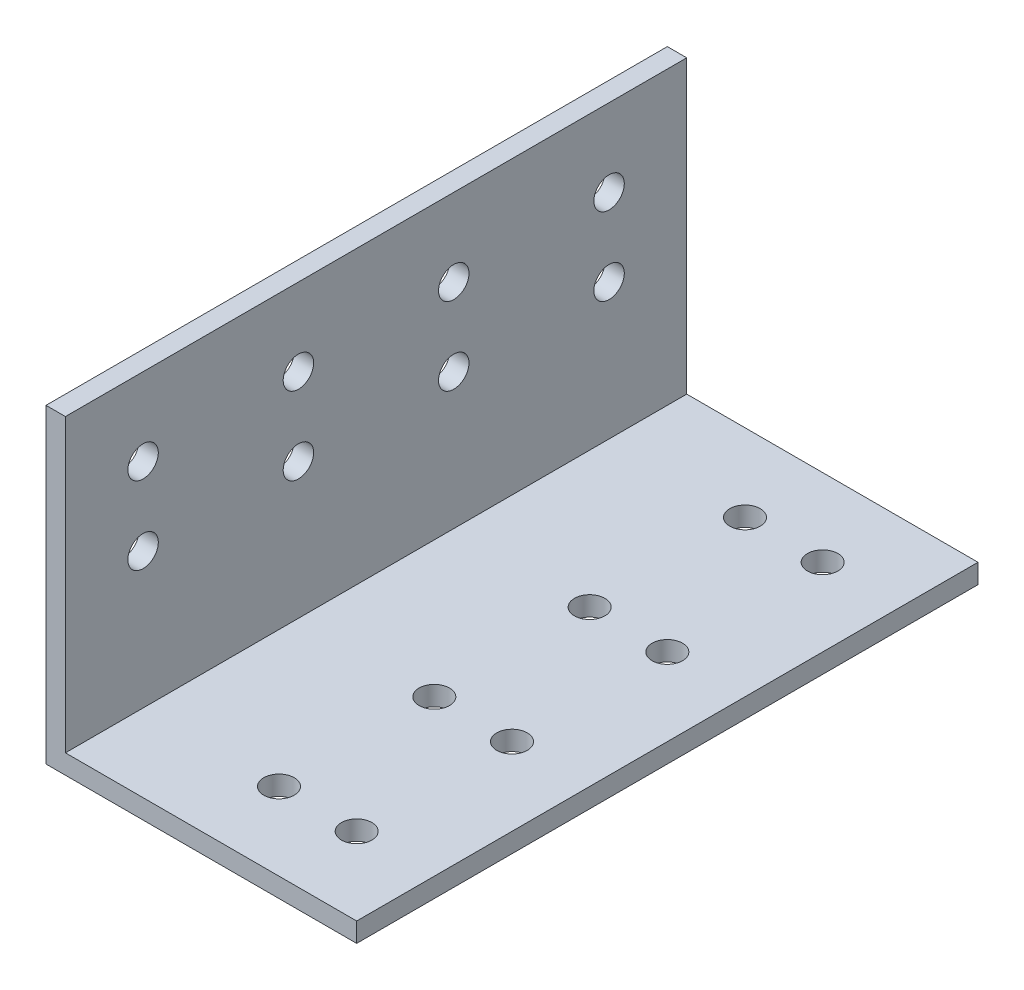
ISO-10303-21;
HEADER;
FILE_DESCRIPTION(('STEP AP214'),'2;1');
FILE_NAME('part.step','',(''),(''),'','','');
FILE_SCHEMA(('AUTOMOTIVE_DESIGN { 1 0 10303 214 1 1 1 1 }'));
ENDSEC;
DATA;
#1=APPLICATION_CONTEXT('core data for automotive mechanical design processes');
#2=APPLICATION_PROTOCOL_DEFINITION('international standard','automotive_design',2000,#1);
#3=PRODUCT_CONTEXT('',#1,'mechanical');
#4=PRODUCT('Part','Part','',(#3));
#5=PRODUCT_RELATED_PRODUCT_CATEGORY('part','',(#4));
#6=PRODUCT_DEFINITION_FORMATION('','',#4);
#7=PRODUCT_DEFINITION_CONTEXT('part definition',#1,'design');
#8=PRODUCT_DEFINITION('design','',#6,#7);
#9=PRODUCT_DEFINITION_SHAPE('','',#8);
#10=(LENGTH_UNIT() NAMED_UNIT(*) SI_UNIT(.MILLI.,.METRE.));
#11=(NAMED_UNIT(*) PLANE_ANGLE_UNIT() SI_UNIT($,.RADIAN.));
#12=(NAMED_UNIT(*) SI_UNIT($,.STERADIAN.) SOLID_ANGLE_UNIT());
#13=UNCERTAINTY_MEASURE_WITH_UNIT(LENGTH_MEASURE(1.E-05),#10,'distance_accuracy_value','');
#14=(GEOMETRIC_REPRESENTATION_CONTEXT(3) GLOBAL_UNCERTAINTY_ASSIGNED_CONTEXT((#13)) GLOBAL_UNIT_ASSIGNED_CONTEXT((#10,
#11,#12)) REPRESENTATION_CONTEXT('',''));
#15=CARTESIAN_POINT('',(0.,0.,0.));
#16=DIRECTION('',(0.,0.,1.));
#17=DIRECTION('',(1.,0.,0.));
#18=AXIS2_PLACEMENT_3D('',#15,#16,#17);
#19=CARTESIAN_POINT('',(0.,50.8,101.6));
#20=DIRECTION('',(0.,1.,0.));
#21=DIRECTION('',(0.,0.,1.));
#22=AXIS2_PLACEMENT_3D('',#19,#20,#21);
#23=PLANE('',#22);
#24=DIRECTION('',(1.,0.,0.));
#25=VECTOR('',#24,1.);
#26=CARTESIAN_POINT('',(0.,50.8,0.));
#27=LINE('',#26,#25);
#28=CARTESIAN_POINT('',(0.,50.8,0.));
#29=VERTEX_POINT('',#28);
#30=CARTESIAN_POINT('',(3.175,50.8,0.));
#31=VERTEX_POINT('',#30);
#32=EDGE_CURVE('E129',#29,#31,#27,.T.);
#33=ORIENTED_EDGE('',*,*,#32,.F.);
#34=DIRECTION('',(0.,0.,-1.));
#35=VECTOR('',#34,1.);
#36=CARTESIAN_POINT('',(0.,50.8,101.6));
#37=LINE('',#36,#35);
#38=CARTESIAN_POINT('',(0.,50.8,101.6));
#39=VERTEX_POINT('',#38);
#40=EDGE_CURVE('E11',#39,#29,#37,.T.);
#41=ORIENTED_EDGE('',*,*,#40,.F.);
#42=DIRECTION('',(1.,0.,0.));
#43=VECTOR('',#42,1.);
#44=CARTESIAN_POINT('',(0.,50.8,101.6));
#45=LINE('',#44,#43);
#46=CARTESIAN_POINT('',(3.175,50.8,101.6));
#47=VERTEX_POINT('',#46);
#48=EDGE_CURVE('E150',#39,#47,#45,.T.);
#49=ORIENTED_EDGE('',*,*,#48,.T.);
#50=DIRECTION('',(0.,0.,-1.));
#51=VECTOR('',#50,1.);
#52=CARTESIAN_POINT('',(3.175,50.8,101.6));
#53=LINE('',#52,#51);
#54=EDGE_CURVE('E40',#47,#31,#53,.T.);
#55=ORIENTED_EDGE('',*,*,#54,.T.);
#56=EDGE_LOOP('',(#33,#41,#49,#55));
#57=FACE_BOUND('',#56,.T.);
#58=ADVANCED_FACE('F37',(#57),#23,.T.);
#59=CARTESIAN_POINT('',(0.,0.,101.6));
#60=DIRECTION('',(-1.,0.,0.));
#61=DIRECTION('',(0.,0.,1.));
#62=AXIS2_PLACEMENT_3D('',#59,#60,#61);
#63=PLANE('',#62);
#64=CARTESIAN_POINT('',(0.,38.0999999999998,38.1));
#65=DIRECTION('',(1.,0.,0.));
#66=DIRECTION('',(0.,1.,0.));
#67=AXIS2_PLACEMENT_3D('',#64,#65,#66);
#68=CIRCLE('',#67,2.4892);
#69=CARTESIAN_POINT('',(0.,40.5891999999998,38.1));
#70=VERTEX_POINT('',#69);
#71=EDGE_CURVE('E427',#70,#70,#68,.T.);
#72=ORIENTED_EDGE('',*,*,#71,.T.);
#73=EDGE_LOOP('',(#72));
#74=FACE_BOUND('',#73,.T.);
#75=CARTESIAN_POINT('',(0.,25.3999999999995,88.9));
#76=DIRECTION('',(1.,0.,0.));
#77=DIRECTION('',(0.,1.,0.));
#78=AXIS2_PLACEMENT_3D('',#75,#76,#77);
#79=CIRCLE('',#78,2.48920000000002);
#80=CARTESIAN_POINT('',(0.,27.8891999999995,88.9));
#81=VERTEX_POINT('',#80);
#82=EDGE_CURVE('E421',#81,#81,#79,.T.);
#83=ORIENTED_EDGE('',*,*,#82,.T.);
#84=EDGE_LOOP('',(#83));
#85=FACE_BOUND('',#84,.T.);
#86=CARTESIAN_POINT('',(0.,25.3999999999996,63.5));
#87=DIRECTION('',(1.,0.,0.));
#88=DIRECTION('',(0.,1.,0.));
#89=AXIS2_PLACEMENT_3D('',#86,#87,#88);
#90=CIRCLE('',#89,2.4892);
#91=CARTESIAN_POINT('',(0.,27.8891999999996,63.5));
#92=VERTEX_POINT('',#91);
#93=EDGE_CURVE('E434',#92,#92,#90,.T.);
#94=ORIENTED_EDGE('',*,*,#93,.T.);
#95=EDGE_LOOP('',(#94));
#96=FACE_BOUND('',#95,.T.);
#97=CARTESIAN_POINT('',(0.,25.3999999999998,38.1));
#98=DIRECTION('',(1.,0.,0.));
#99=DIRECTION('',(0.,1.,0.));
#100=AXIS2_PLACEMENT_3D('',#97,#98,#99);
#101=CIRCLE('',#100,2.4892);
#102=CARTESIAN_POINT('',(0.,27.8891999999998,38.1));
#103=VERTEX_POINT('',#102);
#104=EDGE_CURVE('E223',#103,#103,#101,.T.);
#105=ORIENTED_EDGE('',*,*,#104,.T.);
#106=EDGE_LOOP('',(#105));
#107=FACE_BOUND('',#106,.T.);
#108=CARTESIAN_POINT('',(0.,38.0999999999996,63.5));
#109=DIRECTION('',(1.,0.,0.));
#110=DIRECTION('',(0.,1.,0.));
#111=AXIS2_PLACEMENT_3D('',#108,#109,#110);
#112=CIRCLE('',#111,2.4892);
#113=CARTESIAN_POINT('',(0.,40.5891999999996,63.5));
#114=VERTEX_POINT('',#113);
#115=EDGE_CURVE('E402',#114,#114,#112,.T.);
#116=ORIENTED_EDGE('',*,*,#115,.T.);
#117=EDGE_LOOP('',(#116));
#118=FACE_BOUND('',#117,.T.);
#119=CARTESIAN_POINT('',(0.,38.0999999999995,88.9));
#120=DIRECTION('',(1.,0.,0.));
#121=DIRECTION('',(0.,1.,0.));
#122=AXIS2_PLACEMENT_3D('',#119,#120,#121);
#123=CIRCLE('',#122,2.48920000000002);
#124=CARTESIAN_POINT('',(0.,40.5891999999995,88.9));
#125=VERTEX_POINT('',#124);
#126=EDGE_CURVE('E404',#125,#125,#123,.T.);
#127=ORIENTED_EDGE('',*,*,#126,.T.);
#128=EDGE_LOOP('',(#127));
#129=FACE_BOUND('',#128,.T.);
#130=CARTESIAN_POINT('',(0.,38.1,12.7));
#131=DIRECTION('',(1.,0.,0.));
#132=DIRECTION('',(0.,1.,0.));
#133=AXIS2_PLACEMENT_3D('',#130,#131,#132);
#134=CIRCLE('',#133,2.4892);
#135=CARTESIAN_POINT('',(0.,40.5892,12.7));
#136=VERTEX_POINT('',#135);
#137=EDGE_CURVE('E415',#136,#136,#134,.T.);
#138=ORIENTED_EDGE('',*,*,#137,.T.);
#139=EDGE_LOOP('',(#138));
#140=FACE_BOUND('',#139,.T.);
#141=CARTESIAN_POINT('',(0.,25.4,12.7));
#142=DIRECTION('',(1.,0.,0.));
#143=DIRECTION('',(0.,1.,0.));
#144=AXIS2_PLACEMENT_3D('',#141,#142,#143);
#145=CIRCLE('',#144,2.4892);
#146=CARTESIAN_POINT('',(0.,27.8892,12.7));
#147=VERTEX_POINT('',#146);
#148=EDGE_CURVE('E222',#147,#147,#145,.T.);
#149=ORIENTED_EDGE('',*,*,#148,.T.);
#150=EDGE_LOOP('',(#149));
#151=FACE_BOUND('',#150,.T.);
#152=DIRECTION('',(0.,1.,0.));
#153=VECTOR('',#152,1.);
#154=CARTESIAN_POINT('',(0.,0.,0.));
#155=LINE('',#154,#153);
#156=CARTESIAN_POINT('',(0.,0.,0.));
#157=VERTEX_POINT('',#156);
#158=EDGE_CURVE('E147',#157,#29,#155,.T.);
#159=ORIENTED_EDGE('',*,*,#158,.F.);
#160=DIRECTION('',(0.,0.,-1.));
#161=VECTOR('',#160,1.);
#162=CARTESIAN_POINT('',(0.,0.,101.6));
#163=LINE('',#162,#161);
#164=CARTESIAN_POINT('',(0.,0.,101.6));
#165=VERTEX_POINT('',#164);
#166=EDGE_CURVE('E47',#165,#157,#163,.T.);
#167=ORIENTED_EDGE('',*,*,#166,.F.);
#168=DIRECTION('',(0.,1.,0.));
#169=VECTOR('',#168,1.);
#170=CARTESIAN_POINT('',(0.,0.,101.6));
#171=LINE('',#170,#169);
#172=EDGE_CURVE('E114',#165,#39,#171,.T.);
#173=ORIENTED_EDGE('',*,*,#172,.T.);
#174=ORIENTED_EDGE('',*,*,#40,.T.);
#175=EDGE_LOOP('',(#159,#167,#173,#174));
#176=FACE_BOUND('',#175,.T.);
#177=ADVANCED_FACE('F164',(#74,#85,#96,#107,#118,#129,#140,#151,#176),#63,.T.);
#178=CARTESIAN_POINT('',(50.8,0.,101.6));
#179=DIRECTION('',(0.,-1.,0.));
#180=DIRECTION('',(1.,0.,0.));
#181=AXIS2_PLACEMENT_3D('',#178,#179,#180);
#182=PLANE('',#181);
#183=CARTESIAN_POINT('',(25.4,0.,88.9000000000002));
#184=DIRECTION('',(0.,1.,0.));
#185=DIRECTION('',(-1.,0.,0.));
#186=AXIS2_PLACEMENT_3D('',#183,#184,#185);
#187=CIRCLE('',#186,2.4892);
#188=CARTESIAN_POINT('',(22.9108,0.,88.9000000000002));
#189=VERTEX_POINT('',#188);
#190=EDGE_CURVE('E284',#189,#189,#187,.T.);
#191=ORIENTED_EDGE('',*,*,#190,.T.);
#192=EDGE_LOOP('',(#191));
#193=FACE_BOUND('',#192,.T.);
#194=CARTESIAN_POINT('',(25.4,0.,63.5000000000002));
#195=DIRECTION('',(0.,1.,0.));
#196=DIRECTION('',(-1.,0.,0.));
#197=AXIS2_PLACEMENT_3D('',#194,#195,#196);
#198=CIRCLE('',#197,2.4892);
#199=CARTESIAN_POINT('',(22.9108,0.,63.5000000000002));
#200=VERTEX_POINT('',#199);
#201=EDGE_CURVE('E276',#200,#200,#198,.T.);
#202=ORIENTED_EDGE('',*,*,#201,.T.);
#203=EDGE_LOOP('',(#202));
#204=FACE_BOUND('',#203,.T.);
#205=CARTESIAN_POINT('',(25.4,0.,38.1000000000002));
#206=DIRECTION('',(0.,1.,0.));
#207=DIRECTION('',(-1.,0.,0.));
#208=AXIS2_PLACEMENT_3D('',#205,#206,#207);
#209=CIRCLE('',#208,2.4892);
#210=CARTESIAN_POINT('',(22.9108,0.,38.1000000000002));
#211=VERTEX_POINT('',#210);
#212=EDGE_CURVE('E268',#211,#211,#209,.T.);
#213=ORIENTED_EDGE('',*,*,#212,.T.);
#214=EDGE_LOOP('',(#213));
#215=FACE_BOUND('',#214,.T.);
#216=CARTESIAN_POINT('',(38.1,0.,88.9));
#217=DIRECTION('',(0.,1.,0.));
#218=DIRECTION('',(-1.,0.,0.));
#219=AXIS2_PLACEMENT_3D('',#216,#217,#218);
#220=CIRCLE('',#219,2.4892);
#221=CARTESIAN_POINT('',(35.6108,0.,88.9));
#222=VERTEX_POINT('',#221);
#223=EDGE_CURVE('E260',#222,#222,#220,.T.);
#224=ORIENTED_EDGE('',*,*,#223,.T.);
#225=EDGE_LOOP('',(#224));
#226=FACE_BOUND('',#225,.T.);
#227=CARTESIAN_POINT('',(38.1,0.,63.5));
#228=DIRECTION('',(0.,1.,0.));
#229=DIRECTION('',(-1.,0.,0.));
#230=AXIS2_PLACEMENT_3D('',#227,#228,#229);
#231=CIRCLE('',#230,2.4892);
#232=CARTESIAN_POINT('',(35.6108,0.,63.5));
#233=VERTEX_POINT('',#232);
#234=EDGE_CURVE('E252',#233,#233,#231,.T.);
#235=ORIENTED_EDGE('',*,*,#234,.T.);
#236=EDGE_LOOP('',(#235));
#237=FACE_BOUND('',#236,.T.);
#238=CARTESIAN_POINT('',(38.1,0.,38.1));
#239=DIRECTION('',(0.,1.,0.));
#240=DIRECTION('',(-1.,0.,0.));
#241=AXIS2_PLACEMENT_3D('',#238,#239,#240);
#242=CIRCLE('',#241,2.4892);
#243=CARTESIAN_POINT('',(35.6108,0.,38.1));
#244=VERTEX_POINT('',#243);
#245=EDGE_CURVE('E244',#244,#244,#242,.T.);
#246=ORIENTED_EDGE('',*,*,#245,.T.);
#247=EDGE_LOOP('',(#246));
#248=FACE_BOUND('',#247,.T.);
#249=CARTESIAN_POINT('',(38.1,0.,12.7));
#250=DIRECTION('',(0.,1.,0.));
#251=DIRECTION('',(-1.,0.,0.));
#252=AXIS2_PLACEMENT_3D('',#249,#250,#251);
#253=CIRCLE('',#252,2.4892);
#254=CARTESIAN_POINT('',(35.6108,0.,12.7));
#255=VERTEX_POINT('',#254);
#256=EDGE_CURVE('E235',#255,#255,#253,.T.);
#257=ORIENTED_EDGE('',*,*,#256,.T.);
#258=EDGE_LOOP('',(#257));
#259=FACE_BOUND('',#258,.T.);
#260=CARTESIAN_POINT('',(25.4,0.,12.7000000000002));
#261=DIRECTION('',(0.,1.,0.));
#262=DIRECTION('',(-1.,0.,0.));
#263=AXIS2_PLACEMENT_3D('',#260,#261,#262);
#264=CIRCLE('',#263,2.4892);
#265=CARTESIAN_POINT('',(22.9108,0.,12.7000000000002));
#266=VERTEX_POINT('',#265);
#267=EDGE_CURVE('E134',#266,#266,#264,.T.);
#268=ORIENTED_EDGE('',*,*,#267,.T.);
#269=EDGE_LOOP('',(#268));
#270=FACE_BOUND('',#269,.T.);
#271=DIRECTION('',(-1.,0.,0.));
#272=VECTOR('',#271,1.);
#273=CARTESIAN_POINT('',(50.8,0.,0.));
#274=LINE('',#273,#272);
#275=CARTESIAN_POINT('',(50.8,0.,0.));
#276=VERTEX_POINT('',#275);
#277=EDGE_CURVE('E100',#276,#157,#274,.T.);
#278=ORIENTED_EDGE('',*,*,#277,.F.);
#279=DIRECTION('',(0.,0.,-1.));
#280=VECTOR('',#279,1.);
#281=CARTESIAN_POINT('',(50.8,0.,101.6));
#282=LINE('',#281,#280);
#283=CARTESIAN_POINT('',(50.8,0.,101.6));
#284=VERTEX_POINT('',#283);
#285=EDGE_CURVE('E95',#284,#276,#282,.T.);
#286=ORIENTED_EDGE('',*,*,#285,.F.);
#287=DIRECTION('',(-1.,0.,0.));
#288=VECTOR('',#287,1.);
#289=CARTESIAN_POINT('',(50.8,0.,101.6));
#290=LINE('',#289,#288);
#291=EDGE_CURVE('E98',#284,#165,#290,.T.);
#292=ORIENTED_EDGE('',*,*,#291,.T.);
#293=ORIENTED_EDGE('',*,*,#166,.T.);
#294=EDGE_LOOP('',(#278,#286,#292,#293));
#295=FACE_BOUND('',#294,.T.);
#296=ADVANCED_FACE('F97',(#193,#204,#215,#226,#237,#248,#259,#270,#295),#182,.T.);
#297=CARTESIAN_POINT('',(50.8,3.175,101.6));
#298=DIRECTION('',(1.,0.,0.));
#299=DIRECTION('',(0.,0.,-1.));
#300=AXIS2_PLACEMENT_3D('',#297,#298,#299);
#301=PLANE('',#300);
#302=DIRECTION('',(0.,-1.,0.));
#303=VECTOR('',#302,1.);
#304=CARTESIAN_POINT('',(50.8,3.175,0.));
#305=LINE('',#304,#303);
#306=CARTESIAN_POINT('',(50.8,3.175,0.));
#307=VERTEX_POINT('',#306);
#308=EDGE_CURVE('E142',#307,#276,#305,.T.);
#309=ORIENTED_EDGE('',*,*,#308,.F.);
#310=DIRECTION('',(0.,0.,-1.));
#311=VECTOR('',#310,1.);
#312=CARTESIAN_POINT('',(50.8,3.175,101.6));
#313=LINE('',#312,#311);
#314=CARTESIAN_POINT('',(50.8,3.175,101.6));
#315=VERTEX_POINT('',#314);
#316=EDGE_CURVE('E106',#315,#307,#313,.T.);
#317=ORIENTED_EDGE('',*,*,#316,.F.);
#318=DIRECTION('',(0.,-1.,0.));
#319=VECTOR('',#318,1.);
#320=CARTESIAN_POINT('',(50.8,3.175,101.6));
#321=LINE('',#320,#319);
#322=EDGE_CURVE('E112',#315,#284,#321,.T.);
#323=ORIENTED_EDGE('',*,*,#322,.T.);
#324=ORIENTED_EDGE('',*,*,#285,.T.);
#325=EDGE_LOOP('',(#309,#317,#323,#324));
#326=FACE_BOUND('',#325,.T.);
#327=ADVANCED_FACE('F117',(#326),#301,.T.);
#328=CARTESIAN_POINT('',(3.175,3.175,101.6));
#329=DIRECTION('',(0.,1.,0.));
#330=DIRECTION('',(-1.,0.,0.));
#331=AXIS2_PLACEMENT_3D('',#328,#329,#330);
#332=PLANE('',#331);
#333=CARTESIAN_POINT('',(25.4,3.175,88.9000000000002));
#334=DIRECTION('',(0.,1.,0.));
#335=DIRECTION('',(-1.,0.,0.));
#336=AXIS2_PLACEMENT_3D('',#333,#334,#335);
#337=CIRCLE('',#336,2.4892);
#338=CARTESIAN_POINT('',(22.9108,3.175,88.9000000000002));
#339=VERTEX_POINT('',#338);
#340=EDGE_CURVE('E229',#339,#339,#337,.T.);
#341=ORIENTED_EDGE('',*,*,#340,.F.);
#342=EDGE_LOOP('',(#341));
#343=FACE_BOUND('',#342,.T.);
#344=CARTESIAN_POINT('',(25.4,3.175,63.5000000000002));
#345=DIRECTION('',(0.,1.,0.));
#346=DIRECTION('',(-1.,0.,0.));
#347=AXIS2_PLACEMENT_3D('',#344,#345,#346);
#348=CIRCLE('',#347,2.4892);
#349=CARTESIAN_POINT('',(22.9108,3.175,63.5000000000002));
#350=VERTEX_POINT('',#349);
#351=EDGE_CURVE('E280',#350,#350,#348,.T.);
#352=ORIENTED_EDGE('',*,*,#351,.F.);
#353=EDGE_LOOP('',(#352));
#354=FACE_BOUND('',#353,.T.);
#355=CARTESIAN_POINT('',(25.4,3.175,38.1000000000002));
#356=DIRECTION('',(0.,1.,0.));
#357=DIRECTION('',(-1.,0.,0.));
#358=AXIS2_PLACEMENT_3D('',#355,#356,#357);
#359=CIRCLE('',#358,2.4892);
#360=CARTESIAN_POINT('',(22.9108,3.175,38.1000000000002));
#361=VERTEX_POINT('',#360);
#362=EDGE_CURVE('E272',#361,#361,#359,.T.);
#363=ORIENTED_EDGE('',*,*,#362,.F.);
#364=EDGE_LOOP('',(#363));
#365=FACE_BOUND('',#364,.T.);
#366=CARTESIAN_POINT('',(38.1,3.175,88.9));
#367=DIRECTION('',(0.,1.,0.));
#368=DIRECTION('',(-1.,0.,0.));
#369=AXIS2_PLACEMENT_3D('',#366,#367,#368);
#370=CIRCLE('',#369,2.4892);
#371=CARTESIAN_POINT('',(35.6108,3.175,88.9));
#372=VERTEX_POINT('',#371);
#373=EDGE_CURVE('E264',#372,#372,#370,.T.);
#374=ORIENTED_EDGE('',*,*,#373,.F.);
#375=EDGE_LOOP('',(#374));
#376=FACE_BOUND('',#375,.T.);
#377=CARTESIAN_POINT('',(38.1,3.175,63.5));
#378=DIRECTION('',(0.,1.,0.));
#379=DIRECTION('',(-1.,0.,0.));
#380=AXIS2_PLACEMENT_3D('',#377,#378,#379);
#381=CIRCLE('',#380,2.4892);
#382=CARTESIAN_POINT('',(35.6108,3.175,63.5));
#383=VERTEX_POINT('',#382);
#384=EDGE_CURVE('E256',#383,#383,#381,.T.);
#385=ORIENTED_EDGE('',*,*,#384,.F.);
#386=EDGE_LOOP('',(#385));
#387=FACE_BOUND('',#386,.T.);
#388=CARTESIAN_POINT('',(38.1,3.175,38.1));
#389=DIRECTION('',(0.,1.,0.));
#390=DIRECTION('',(-1.,0.,0.));
#391=AXIS2_PLACEMENT_3D('',#388,#389,#390);
#392=CIRCLE('',#391,2.4892);
#393=CARTESIAN_POINT('',(35.6108,3.175,38.1));
#394=VERTEX_POINT('',#393);
#395=EDGE_CURVE('E248',#394,#394,#392,.T.);
#396=ORIENTED_EDGE('',*,*,#395,.F.);
#397=EDGE_LOOP('',(#396));
#398=FACE_BOUND('',#397,.T.);
#399=CARTESIAN_POINT('',(38.1,3.175,12.7));
#400=DIRECTION('',(0.,1.,0.));
#401=DIRECTION('',(-1.,0.,0.));
#402=AXIS2_PLACEMENT_3D('',#399,#400,#401);
#403=CIRCLE('',#402,2.4892);
#404=CARTESIAN_POINT('',(35.6108,3.175,12.7));
#405=VERTEX_POINT('',#404);
#406=EDGE_CURVE('E240',#405,#405,#403,.T.);
#407=ORIENTED_EDGE('',*,*,#406,.F.);
#408=EDGE_LOOP('',(#407));
#409=FACE_BOUND('',#408,.T.);
#410=CARTESIAN_POINT('',(25.4,3.175,12.7000000000002));
#411=DIRECTION('',(0.,1.,0.));
#412=DIRECTION('',(-1.,0.,0.));
#413=AXIS2_PLACEMENT_3D('',#410,#411,#412);
#414=CIRCLE('',#413,2.4892);
#415=CARTESIAN_POINT('',(22.9108,3.175,12.7000000000002));
#416=VERTEX_POINT('',#415);
#417=EDGE_CURVE('E239',#416,#416,#414,.T.);
#418=ORIENTED_EDGE('',*,*,#417,.F.);
#419=EDGE_LOOP('',(#418));
#420=FACE_BOUND('',#419,.T.);
#421=DIRECTION('',(1.,0.,0.));
#422=VECTOR('',#421,1.);
#423=CARTESIAN_POINT('',(3.175,3.175,0.));
#424=LINE('',#423,#422);
#425=CARTESIAN_POINT('',(3.175,3.175,0.));
#426=VERTEX_POINT('',#425);
#427=EDGE_CURVE('E138',#426,#307,#424,.T.);
#428=ORIENTED_EDGE('',*,*,#427,.F.);
#429=DIRECTION('',(0.,0.,-1.));
#430=VECTOR('',#429,1.);
#431=CARTESIAN_POINT('',(3.175,3.175,101.6));
#432=LINE('',#431,#430);
#433=CARTESIAN_POINT('',(3.175,3.175,101.6));
#434=VERTEX_POINT('',#433);
#435=EDGE_CURVE('E155',#434,#426,#432,.T.);
#436=ORIENTED_EDGE('',*,*,#435,.F.);
#437=DIRECTION('',(1.,0.,0.));
#438=VECTOR('',#437,1.);
#439=CARTESIAN_POINT('',(3.175,3.175,101.6));
#440=LINE('',#439,#438);
#441=EDGE_CURVE('E119',#434,#315,#440,.T.);
#442=ORIENTED_EDGE('',*,*,#441,.T.);
#443=ORIENTED_EDGE('',*,*,#316,.T.);
#444=EDGE_LOOP('',(#428,#436,#442,#443));
#445=FACE_BOUND('',#444,.T.);
#446=ADVANCED_FACE('F181',(#343,#354,#365,#376,#387,#398,#409,#420,#445),#332,.T.);
#447=CARTESIAN_POINT('',(3.175,50.8,101.6));
#448=DIRECTION('',(1.,0.,0.));
#449=DIRECTION('',(0.,1.,0.));
#450=AXIS2_PLACEMENT_3D('',#447,#448,#449);
#451=PLANE('',#450);
#452=CARTESIAN_POINT('',(3.175,38.0999999999998,38.1));
#453=DIRECTION('',(1.,0.,0.));
#454=DIRECTION('',(0.,1.,0.));
#455=AXIS2_PLACEMENT_3D('',#452,#453,#454);
#456=CIRCLE('',#455,2.4892);
#457=CARTESIAN_POINT('',(3.175,40.5891999999998,38.1));
#458=VERTEX_POINT('',#457);
#459=EDGE_CURVE('E192',#458,#458,#456,.T.);
#460=ORIENTED_EDGE('',*,*,#459,.F.);
#461=EDGE_LOOP('',(#460));
#462=FACE_BOUND('',#461,.T.);
#463=CARTESIAN_POINT('',(3.175,25.3999999999995,88.9));
#464=DIRECTION('',(1.,0.,0.));
#465=DIRECTION('',(0.,1.,0.));
#466=AXIS2_PLACEMENT_3D('',#463,#464,#465);
#467=CIRCLE('',#466,2.48920000000002);
#468=CARTESIAN_POINT('',(3.175,27.8891999999995,88.9));
#469=VERTEX_POINT('',#468);
#470=EDGE_CURVE('E196',#469,#469,#467,.T.);
#471=ORIENTED_EDGE('',*,*,#470,.F.);
#472=EDGE_LOOP('',(#471));
#473=FACE_BOUND('',#472,.T.);
#474=CARTESIAN_POINT('',(3.175,25.3999999999996,63.5));
#475=DIRECTION('',(1.,0.,0.));
#476=DIRECTION('',(0.,1.,0.));
#477=AXIS2_PLACEMENT_3D('',#474,#475,#476);
#478=CIRCLE('',#477,2.4892);
#479=CARTESIAN_POINT('',(3.175,27.8891999999996,63.5));
#480=VERTEX_POINT('',#479);
#481=EDGE_CURVE('E200',#480,#480,#478,.T.);
#482=ORIENTED_EDGE('',*,*,#481,.F.);
#483=EDGE_LOOP('',(#482));
#484=FACE_BOUND('',#483,.T.);
#485=CARTESIAN_POINT('',(3.175,25.3999999999998,38.1));
#486=DIRECTION('',(1.,0.,0.));
#487=DIRECTION('',(0.,1.,0.));
#488=AXIS2_PLACEMENT_3D('',#485,#486,#487);
#489=CIRCLE('',#488,2.4892);
#490=CARTESIAN_POINT('',(3.175,27.8891999999998,38.1));
#491=VERTEX_POINT('',#490);
#492=EDGE_CURVE('E204',#491,#491,#489,.T.);
#493=ORIENTED_EDGE('',*,*,#492,.F.);
#494=EDGE_LOOP('',(#493));
#495=FACE_BOUND('',#494,.T.);
#496=CARTESIAN_POINT('',(3.175,38.0999999999996,63.5));
#497=DIRECTION('',(1.,0.,0.));
#498=DIRECTION('',(0.,1.,0.));
#499=AXIS2_PLACEMENT_3D('',#496,#497,#498);
#500=CIRCLE('',#499,2.4892);
#501=CARTESIAN_POINT('',(3.175,40.5891999999996,63.5));
#502=VERTEX_POINT('',#501);
#503=EDGE_CURVE('E208',#502,#502,#500,.T.);
#504=ORIENTED_EDGE('',*,*,#503,.F.);
#505=EDGE_LOOP('',(#504));
#506=FACE_BOUND('',#505,.T.);
#507=CARTESIAN_POINT('',(3.175,38.0999999999995,88.9));
#508=DIRECTION('',(1.,0.,0.));
#509=DIRECTION('',(0.,1.,0.));
#510=AXIS2_PLACEMENT_3D('',#507,#508,#509);
#511=CIRCLE('',#510,2.48920000000002);
#512=CARTESIAN_POINT('',(3.175,40.5891999999995,88.9));
#513=VERTEX_POINT('',#512);
#514=EDGE_CURVE('E212',#513,#513,#511,.T.);
#515=ORIENTED_EDGE('',*,*,#514,.F.);
#516=EDGE_LOOP('',(#515));
#517=FACE_BOUND('',#516,.T.);
#518=CARTESIAN_POINT('',(3.175,38.1,12.7));
#519=DIRECTION('',(1.,0.,0.));
#520=DIRECTION('',(0.,1.,0.));
#521=AXIS2_PLACEMENT_3D('',#518,#519,#520);
#522=CIRCLE('',#521,2.4892);
#523=CARTESIAN_POINT('',(3.175,40.5892,12.7));
#524=VERTEX_POINT('',#523);
#525=EDGE_CURVE('E216',#524,#524,#522,.T.);
#526=ORIENTED_EDGE('',*,*,#525,.F.);
#527=EDGE_LOOP('',(#526));
#528=FACE_BOUND('',#527,.T.);
#529=CARTESIAN_POINT('',(3.175,25.4,12.7));
#530=DIRECTION('',(1.,0.,0.));
#531=DIRECTION('',(0.,1.,0.));
#532=AXIS2_PLACEMENT_3D('',#529,#530,#531);
#533=CIRCLE('',#532,2.4892);
#534=CARTESIAN_POINT('',(3.175,27.8892,12.7));
#535=VERTEX_POINT('',#534);
#536=EDGE_CURVE('E219',#535,#535,#533,.T.);
#537=ORIENTED_EDGE('',*,*,#536,.F.);
#538=EDGE_LOOP('',(#537));
#539=FACE_BOUND('',#538,.T.);
#540=DIRECTION('',(0.,-1.,0.));
#541=VECTOR('',#540,1.);
#542=CARTESIAN_POINT('',(3.175,50.8,0.));
#543=LINE('',#542,#541);
#544=EDGE_CURVE('E133',#31,#426,#543,.T.);
#545=ORIENTED_EDGE('',*,*,#544,.F.);
#546=ORIENTED_EDGE('',*,*,#54,.F.);
#547=DIRECTION('',(0.,-1.,0.));
#548=VECTOR('',#547,1.);
#549=CARTESIAN_POINT('',(3.175,50.8,101.6));
#550=LINE('',#549,#548);
#551=EDGE_CURVE('E123',#47,#434,#550,.T.);
#552=ORIENTED_EDGE('',*,*,#551,.T.);
#553=ORIENTED_EDGE('',*,*,#435,.T.);
#554=EDGE_LOOP('',(#545,#546,#552,#553));
#555=FACE_BOUND('',#554,.T.);
#556=ADVANCED_FACE('F161',(#462,#473,#484,#495,#506,#517,#528,#539,#555),#451,.T.);
#557=CARTESIAN_POINT('',(0.,0.,101.6));
#558=DIRECTION('',(0.,0.,-1.));
#559=DIRECTION('',(-1.,0.,0.));
#560=AXIS2_PLACEMENT_3D('',#557,#558,#559);
#561=PLANE('',#560);
#562=ORIENTED_EDGE('',*,*,#48,.F.);
#563=ORIENTED_EDGE('',*,*,#172,.F.);
#564=ORIENTED_EDGE('',*,*,#291,.F.);
#565=ORIENTED_EDGE('',*,*,#322,.F.);
#566=ORIENTED_EDGE('',*,*,#441,.F.);
#567=ORIENTED_EDGE('',*,*,#551,.F.);
#568=EDGE_LOOP('',(#562,#563,#564,#565,#566,#567));
#569=FACE_BOUND('',#568,.T.);
#570=ADVANCED_FACE('F110',(#569),#561,.F.);
#571=CARTESIAN_POINT('',(0.,0.,0.));
#572=DIRECTION('',(0.,0.,-1.));
#573=DIRECTION('',(-1.,0.,0.));
#574=AXIS2_PLACEMENT_3D('',#571,#572,#573);
#575=PLANE('',#574);
#576=ORIENTED_EDGE('',*,*,#32,.T.);
#577=ORIENTED_EDGE('',*,*,#544,.T.);
#578=ORIENTED_EDGE('',*,*,#427,.T.);
#579=ORIENTED_EDGE('',*,*,#308,.T.);
#580=ORIENTED_EDGE('',*,*,#277,.T.);
#581=ORIENTED_EDGE('',*,*,#158,.T.);
#582=EDGE_LOOP('',(#576,#577,#578,#579,#580,#581));
#583=FACE_BOUND('',#582,.T.);
#584=ADVANCED_FACE('F163',(#583),#575,.T.);
#585=CARTESIAN_POINT('',(25.4,0.,12.7000000000002));
#586=DIRECTION('',(0.,1.,0.));
#587=DIRECTION('',(-1.,0.,0.));
#588=AXIS2_PLACEMENT_3D('',#585,#586,#587);
#589=CYLINDRICAL_SURFACE('',#588,2.4892);
#590=ORIENTED_EDGE('',*,*,#267,.F.);
#591=EDGE_LOOP('',(#590));
#592=FACE_BOUND('',#591,.T.);
#593=ORIENTED_EDGE('',*,*,#417,.T.);
#594=EDGE_LOOP('',(#593));
#595=FACE_BOUND('',#594,.T.);
#596=ADVANCED_FACE('F328',(#592,#595),#589,.F.);
#597=CARTESIAN_POINT('',(38.1,0.,12.7));
#598=DIRECTION('',(0.,1.,0.));
#599=DIRECTION('',(-1.,0.,0.));
#600=AXIS2_PLACEMENT_3D('',#597,#598,#599);
#601=CYLINDRICAL_SURFACE('',#600,2.4892);
#602=ORIENTED_EDGE('',*,*,#256,.F.);
#603=EDGE_LOOP('',(#602));
#604=FACE_BOUND('',#603,.T.);
#605=ORIENTED_EDGE('',*,*,#406,.T.);
#606=EDGE_LOOP('',(#605));
#607=FACE_BOUND('',#606,.T.);
#608=ADVANCED_FACE('F331',(#604,#607),#601,.F.);
#609=CARTESIAN_POINT('',(38.1,0.,38.1));
#610=DIRECTION('',(0.,1.,0.));
#611=DIRECTION('',(-1.,0.,0.));
#612=AXIS2_PLACEMENT_3D('',#609,#610,#611);
#613=CYLINDRICAL_SURFACE('',#612,2.4892);
#614=ORIENTED_EDGE('',*,*,#245,.F.);
#615=EDGE_LOOP('',(#614));
#616=FACE_BOUND('',#615,.T.);
#617=ORIENTED_EDGE('',*,*,#395,.T.);
#618=EDGE_LOOP('',(#617));
#619=FACE_BOUND('',#618,.T.);
#620=ADVANCED_FACE('F338',(#616,#619),#613,.F.);
#621=CARTESIAN_POINT('',(38.1,0.,63.5));
#622=DIRECTION('',(0.,1.,0.));
#623=DIRECTION('',(-1.,0.,0.));
#624=AXIS2_PLACEMENT_3D('',#621,#622,#623);
#625=CYLINDRICAL_SURFACE('',#624,2.4892);
#626=ORIENTED_EDGE('',*,*,#234,.F.);
#627=EDGE_LOOP('',(#626));
#628=FACE_BOUND('',#627,.T.);
#629=ORIENTED_EDGE('',*,*,#384,.T.);
#630=EDGE_LOOP('',(#629));
#631=FACE_BOUND('',#630,.T.);
#632=ADVANCED_FACE('F359',(#628,#631),#625,.F.);
#633=CARTESIAN_POINT('',(38.1,0.,88.9));
#634=DIRECTION('',(0.,1.,0.));
#635=DIRECTION('',(-1.,0.,0.));
#636=AXIS2_PLACEMENT_3D('',#633,#634,#635);
#637=CYLINDRICAL_SURFACE('',#636,2.4892);
#638=ORIENTED_EDGE('',*,*,#223,.F.);
#639=EDGE_LOOP('',(#638));
#640=FACE_BOUND('',#639,.T.);
#641=ORIENTED_EDGE('',*,*,#373,.T.);
#642=EDGE_LOOP('',(#641));
#643=FACE_BOUND('',#642,.T.);
#644=ADVANCED_FACE('F355',(#640,#643),#637,.F.);
#645=CARTESIAN_POINT('',(25.4,0.,38.1000000000002));
#646=DIRECTION('',(0.,1.,0.));
#647=DIRECTION('',(-1.,0.,0.));
#648=AXIS2_PLACEMENT_3D('',#645,#646,#647);
#649=CYLINDRICAL_SURFACE('',#648,2.4892);
#650=ORIENTED_EDGE('',*,*,#212,.F.);
#651=EDGE_LOOP('',(#650));
#652=FACE_BOUND('',#651,.T.);
#653=ORIENTED_EDGE('',*,*,#362,.T.);
#654=EDGE_LOOP('',(#653));
#655=FACE_BOUND('',#654,.T.);
#656=ADVANCED_FACE('F351',(#652,#655),#649,.F.);
#657=CARTESIAN_POINT('',(25.4,0.,63.5000000000002));
#658=DIRECTION('',(0.,1.,0.));
#659=DIRECTION('',(-1.,0.,0.));
#660=AXIS2_PLACEMENT_3D('',#657,#658,#659);
#661=CYLINDRICAL_SURFACE('',#660,2.4892);
#662=ORIENTED_EDGE('',*,*,#201,.F.);
#663=EDGE_LOOP('',(#662));
#664=FACE_BOUND('',#663,.T.);
#665=ORIENTED_EDGE('',*,*,#351,.T.);
#666=EDGE_LOOP('',(#665));
#667=FACE_BOUND('',#666,.T.);
#668=ADVANCED_FACE('F347',(#664,#667),#661,.F.);
#669=CARTESIAN_POINT('',(25.4,0.,88.9000000000002));
#670=DIRECTION('',(0.,1.,0.));
#671=DIRECTION('',(-1.,0.,0.));
#672=AXIS2_PLACEMENT_3D('',#669,#670,#671);
#673=CYLINDRICAL_SURFACE('',#672,2.4892);
#674=ORIENTED_EDGE('',*,*,#190,.F.);
#675=EDGE_LOOP('',(#674));
#676=FACE_BOUND('',#675,.T.);
#677=ORIENTED_EDGE('',*,*,#340,.T.);
#678=EDGE_LOOP('',(#677));
#679=FACE_BOUND('',#678,.T.);
#680=ADVANCED_FACE('F343',(#676,#679),#673,.F.);
#681=CARTESIAN_POINT('',(0.,25.4,12.7));
#682=DIRECTION('',(1.,0.,0.));
#683=DIRECTION('',(0.,1.,0.));
#684=AXIS2_PLACEMENT_3D('',#681,#682,#683);
#685=CYLINDRICAL_SURFACE('',#684,2.4892);
#686=ORIENTED_EDGE('',*,*,#148,.F.);
#687=EDGE_LOOP('',(#686));
#688=FACE_BOUND('',#687,.T.);
#689=ORIENTED_EDGE('',*,*,#536,.T.);
#690=EDGE_LOOP('',(#689));
#691=FACE_BOUND('',#690,.T.);
#692=ADVANCED_FACE('F346',(#688,#691),#685,.F.);
#693=CARTESIAN_POINT('',(0.,38.1,12.7));
#694=DIRECTION('',(1.,0.,0.));
#695=DIRECTION('',(0.,1.,0.));
#696=AXIS2_PLACEMENT_3D('',#693,#694,#695);
#697=CYLINDRICAL_SURFACE('',#696,2.4892);
#698=ORIENTED_EDGE('',*,*,#137,.F.);
#699=EDGE_LOOP('',(#698));
#700=FACE_BOUND('',#699,.T.);
#701=ORIENTED_EDGE('',*,*,#525,.T.);
#702=EDGE_LOOP('',(#701));
#703=FACE_BOUND('',#702,.T.);
#704=ADVANCED_FACE('F369',(#700,#703),#697,.F.);
#705=CARTESIAN_POINT('',(0.,38.0999999999995,88.9));
#706=DIRECTION('',(1.,0.,0.));
#707=DIRECTION('',(0.,1.,0.));
#708=AXIS2_PLACEMENT_3D('',#705,#706,#707);
#709=CYLINDRICAL_SURFACE('',#708,2.48920000000002);
#710=ORIENTED_EDGE('',*,*,#126,.F.);
#711=EDGE_LOOP('',(#710));
#712=FACE_BOUND('',#711,.T.);
#713=ORIENTED_EDGE('',*,*,#514,.T.);
#714=EDGE_LOOP('',(#713));
#715=FACE_BOUND('',#714,.T.);
#716=ADVANCED_FACE('F390',(#712,#715),#709,.F.);
#717=CARTESIAN_POINT('',(0.,38.0999999999996,63.5));
#718=DIRECTION('',(1.,0.,0.));
#719=DIRECTION('',(0.,1.,0.));
#720=AXIS2_PLACEMENT_3D('',#717,#718,#719);
#721=CYLINDRICAL_SURFACE('',#720,2.4892);
#722=ORIENTED_EDGE('',*,*,#115,.F.);
#723=EDGE_LOOP('',(#722));
#724=FACE_BOUND('',#723,.T.);
#725=ORIENTED_EDGE('',*,*,#503,.T.);
#726=EDGE_LOOP('',(#725));
#727=FACE_BOUND('',#726,.T.);
#728=ADVANCED_FACE('F379',(#724,#727),#721,.F.);
#729=CARTESIAN_POINT('',(0.,25.3999999999998,38.1));
#730=DIRECTION('',(1.,0.,0.));
#731=DIRECTION('',(0.,1.,0.));
#732=AXIS2_PLACEMENT_3D('',#729,#730,#731);
#733=CYLINDRICAL_SURFACE('',#732,2.4892);
#734=ORIENTED_EDGE('',*,*,#104,.F.);
#735=EDGE_LOOP('',(#734));
#736=FACE_BOUND('',#735,.T.);
#737=ORIENTED_EDGE('',*,*,#492,.T.);
#738=EDGE_LOOP('',(#737));
#739=FACE_BOUND('',#738,.T.);
#740=ADVANCED_FACE('F375',(#736,#739),#733,.F.);
#741=CARTESIAN_POINT('',(0.,25.3999999999996,63.5));
#742=DIRECTION('',(1.,0.,0.));
#743=DIRECTION('',(0.,1.,0.));
#744=AXIS2_PLACEMENT_3D('',#741,#742,#743);
#745=CYLINDRICAL_SURFACE('',#744,2.4892);
#746=ORIENTED_EDGE('',*,*,#93,.F.);
#747=EDGE_LOOP('',(#746));
#748=FACE_BOUND('',#747,.T.);
#749=ORIENTED_EDGE('',*,*,#481,.T.);
#750=EDGE_LOOP('',(#749));
#751=FACE_BOUND('',#750,.T.);
#752=ADVANCED_FACE('F371',(#748,#751),#745,.F.);
#753=CARTESIAN_POINT('',(0.,25.3999999999995,88.9));
#754=DIRECTION('',(1.,0.,0.));
#755=DIRECTION('',(0.,1.,0.));
#756=AXIS2_PLACEMENT_3D('',#753,#754,#755);
#757=CYLINDRICAL_SURFACE('',#756,2.48920000000002);
#758=ORIENTED_EDGE('',*,*,#82,.F.);
#759=EDGE_LOOP('',(#758));
#760=FACE_BOUND('',#759,.T.);
#761=ORIENTED_EDGE('',*,*,#470,.T.);
#762=EDGE_LOOP('',(#761));
#763=FACE_BOUND('',#762,.T.);
#764=ADVANCED_FACE('F374',(#760,#763),#757,.F.);
#765=CARTESIAN_POINT('',(0.,38.0999999999998,38.1));
#766=DIRECTION('',(1.,0.,0.));
#767=DIRECTION('',(0.,1.,0.));
#768=AXIS2_PLACEMENT_3D('',#765,#766,#767);
#769=CYLINDRICAL_SURFACE('',#768,2.4892);
#770=ORIENTED_EDGE('',*,*,#71,.F.);
#771=EDGE_LOOP('',(#770));
#772=FACE_BOUND('',#771,.T.);
#773=ORIENTED_EDGE('',*,*,#459,.T.);
#774=EDGE_LOOP('',(#773));
#775=FACE_BOUND('',#774,.T.);
#776=ADVANCED_FACE('F381',(#772,#775),#769,.F.);
#777=CLOSED_SHELL('',(#58,#177,#296,#327,#446,#556,#570,#584,#596,#608,#620,#632,#644,#656,#668,
#680,#692,#704,#716,#728,#740,#752,#764,#776));
#778=MANIFOLD_SOLID_BREP('B2',#777);
#779=ADVANCED_BREP_SHAPE_REPRESENTATION('',(#18,#778),#14);
#780=SHAPE_DEFINITION_REPRESENTATION(#9,#779);
ENDSEC;
END-ISO-10303-21;
